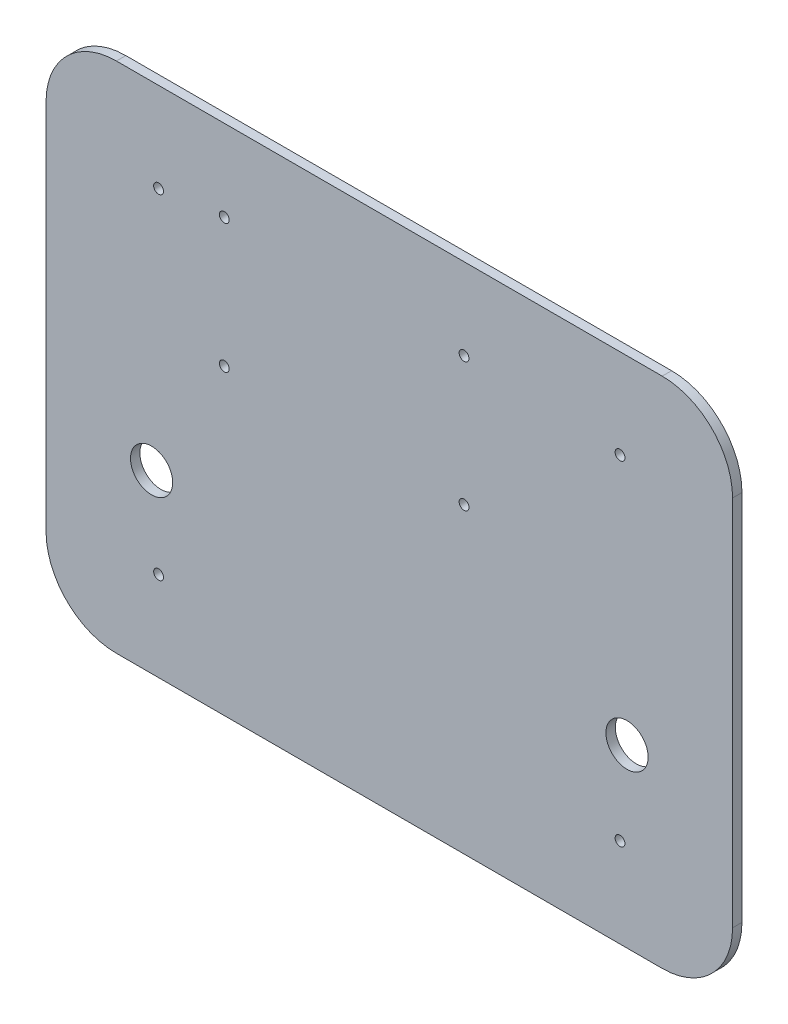
ISO-10303-21;
HEADER;
FILE_DESCRIPTION(('STEP AP214'),'2;1');
FILE_NAME('part.step','',(''),(''),'','','');
FILE_SCHEMA(('AUTOMOTIVE_DESIGN { 1 0 10303 214 1 1 1 1 }'));
ENDSEC;
DATA;
#1=APPLICATION_CONTEXT('core data for automotive mechanical design processes');
#2=APPLICATION_PROTOCOL_DEFINITION('international standard','automotive_design',2000,#1);
#3=PRODUCT_CONTEXT('',#1,'mechanical');
#4=PRODUCT('Part','Part','',(#3));
#5=PRODUCT_RELATED_PRODUCT_CATEGORY('part','',(#4));
#6=PRODUCT_DEFINITION_FORMATION('','',#4);
#7=PRODUCT_DEFINITION_CONTEXT('part definition',#1,'design');
#8=PRODUCT_DEFINITION('design','',#6,#7);
#9=PRODUCT_DEFINITION_SHAPE('','',#8);
#10=(LENGTH_UNIT() NAMED_UNIT(*) SI_UNIT(.MILLI.,.METRE.));
#11=(NAMED_UNIT(*) PLANE_ANGLE_UNIT() SI_UNIT($,.RADIAN.));
#12=(NAMED_UNIT(*) SI_UNIT($,.STERADIAN.) SOLID_ANGLE_UNIT());
#13=UNCERTAINTY_MEASURE_WITH_UNIT(LENGTH_MEASURE(1.E-05),#10,'distance_accuracy_value','');
#14=(GEOMETRIC_REPRESENTATION_CONTEXT(3) GLOBAL_UNCERTAINTY_ASSIGNED_CONTEXT((#13)) GLOBAL_UNIT_ASSIGNED_CONTEXT((#10,
#11,#12)) REPRESENTATION_CONTEXT('',''));
#15=CARTESIAN_POINT('',(0.,0.,0.));
#16=DIRECTION('',(0.,0.,1.));
#17=DIRECTION('',(1.,0.,0.));
#18=AXIS2_PLACEMENT_3D('',#15,#16,#17);
#19=CARTESIAN_POINT('',(-116.3599938182,-79.35999381827,4.));
#20=DIRECTION('',(0.,0.,-1.));
#21=DIRECTION('',(-1.,0.,0.));
#22=AXIS2_PLACEMENT_3D('',#19,#20,#21);
#23=PLANE('',#22);
#24=CARTESIAN_POINT('',(-70.3599938181999,19.6599938182702,4.));
#25=DIRECTION('',(0.,0.,1.));
#26=DIRECTION('',(1.,0.,0.));
#27=AXIS2_PLACEMENT_3D('',#24,#25,#26);
#28=CIRCLE('',#27,2.1);
#29=CARTESIAN_POINT('',(-68.2599938181998,19.6599938182702,4.));
#30=VERTEX_POINT('',#29);
#31=EDGE_CURVE('E227',#30,#30,#28,.T.);
#32=ORIENTED_EDGE('',*,*,#31,.F.);
#33=EDGE_LOOP('',(#32));
#34=FACE_BOUND('',#33,.T.);
#35=CARTESIAN_POINT('',(31.8599938181998,74.6599938182699,4.));
#36=DIRECTION('',(0.,0.,1.));
#37=DIRECTION('',(1.,0.,0.));
#38=AXIS2_PLACEMENT_3D('',#35,#36,#37);
#39=CIRCLE('',#38,2.1);
#40=CARTESIAN_POINT('',(33.9599938181998,74.6599938182699,4.));
#41=VERTEX_POINT('',#40);
#42=EDGE_CURVE('E233',#41,#41,#39,.T.);
#43=ORIENTED_EDGE('',*,*,#42,.F.);
#44=EDGE_LOOP('',(#43));
#45=FACE_BOUND('',#44,.T.);
#46=CARTESIAN_POINT('',(31.8599938181998,19.65999381827,4.));
#47=DIRECTION('',(0.,0.,1.));
#48=DIRECTION('',(1.,0.,0.));
#49=AXIS2_PLACEMENT_3D('',#46,#47,#48);
#50=CIRCLE('',#49,2.1);
#51=CARTESIAN_POINT('',(33.9599938181998,19.65999381827,4.));
#52=VERTEX_POINT('',#51);
#53=EDGE_CURVE('E234',#52,#52,#50,.T.);
#54=ORIENTED_EDGE('',*,*,#53,.F.);
#55=EDGE_LOOP('',(#54));
#56=FACE_BOUND('',#55,.T.);
#57=CARTESIAN_POINT('',(-70.3599938181998,74.6599938182702,4.));
#58=DIRECTION('',(0.,0.,1.));
#59=DIRECTION('',(1.,0.,0.));
#60=AXIS2_PLACEMENT_3D('',#57,#58,#59);
#61=CIRCLE('',#60,2.1);
#62=CARTESIAN_POINT('',(-68.2599938181998,74.6599938182702,4.));
#63=VERTEX_POINT('',#62);
#64=EDGE_CURVE('E224',#63,#63,#61,.T.);
#65=ORIENTED_EDGE('',*,*,#64,.F.);
#66=EDGE_LOOP('',(#65));
#67=FACE_BOUND('',#66,.T.);
#68=CARTESIAN_POINT('',(-116.3599938182,-79.35999381827,4.));
#69=DIRECTION('',(0.,0.,1.));
#70=DIRECTION('',(-1.,0.,0.));
#71=AXIS2_PLACEMENT_3D('',#68,#69,#70);
#72=CIRCLE('',#71,30.);
#73=CARTESIAN_POINT('',(-146.3599938182,-79.3599938182698,4.));
#74=VERTEX_POINT('',#73);
#75=CARTESIAN_POINT('',(-116.3599938182,-109.35999381827,4.));
#76=VERTEX_POINT('',#75);
#77=EDGE_CURVE('E154',#74,#76,#72,.T.);
#78=ORIENTED_EDGE('',*,*,#77,.T.);
#79=DIRECTION('',(1.,0.,0.));
#80=VECTOR('',#79,1.);
#81=CARTESIAN_POINT('',(-116.3599938182,-109.35999381827,4.));
#82=LINE('',#81,#80);
#83=CARTESIAN_POINT('',(116.3599938182,-109.35999381827,4.));
#84=VERTEX_POINT('',#83);
#85=EDGE_CURVE('E102',#76,#84,#82,.T.);
#86=ORIENTED_EDGE('',*,*,#85,.T.);
#87=CARTESIAN_POINT('',(116.3599938182,-79.35999381827,4.));
#88=DIRECTION('',(0.,0.,1.));
#89=DIRECTION('',(1.,0.,0.));
#90=AXIS2_PLACEMENT_3D('',#87,#88,#89);
#91=CIRCLE('',#90,30.);
#92=CARTESIAN_POINT('',(146.3599938182,-79.35999381827,4.));
#93=VERTEX_POINT('',#92);
#94=EDGE_CURVE('E169',#84,#93,#91,.T.);
#95=ORIENTED_EDGE('',*,*,#94,.T.);
#96=DIRECTION('',(0.,1.,0.));
#97=VECTOR('',#96,1.);
#98=CARTESIAN_POINT('',(146.3599938182,-79.3599938182698,4.));
#99=LINE('',#98,#97);
#100=CARTESIAN_POINT('',(146.3599938182,79.3599938182698,4.));
#101=VERTEX_POINT('',#100);
#102=EDGE_CURVE('E182',#93,#101,#99,.T.);
#103=ORIENTED_EDGE('',*,*,#102,.T.);
#104=CARTESIAN_POINT('',(116.3599938182,79.35999381827,4.));
#105=DIRECTION('',(0.,0.,1.));
#106=DIRECTION('',(-1.,0.,0.));
#107=AXIS2_PLACEMENT_3D('',#104,#105,#106);
#108=CIRCLE('',#107,30.);
#109=CARTESIAN_POINT('',(116.3599938182,109.35999381827,4.));
#110=VERTEX_POINT('',#109);
#111=EDGE_CURVE('E121',#101,#110,#108,.T.);
#112=ORIENTED_EDGE('',*,*,#111,.T.);
#113=DIRECTION('',(-1.,0.,0.));
#114=VECTOR('',#113,1.);
#115=CARTESIAN_POINT('',(-116.3599938182,109.35999381827,4.));
#116=LINE('',#115,#114);
#117=CARTESIAN_POINT('',(-116.3599938182,109.35999381827,4.));
#118=VERTEX_POINT('',#117);
#119=EDGE_CURVE('E115',#110,#118,#116,.T.);
#120=ORIENTED_EDGE('',*,*,#119,.T.);
#121=CARTESIAN_POINT('',(-116.3599938182,79.35999381827,4.));
#122=DIRECTION('',(0.,0.,1.));
#123=DIRECTION('',(-1.,0.,0.));
#124=AXIS2_PLACEMENT_3D('',#121,#122,#123);
#125=CIRCLE('',#124,30.);
#126=CARTESIAN_POINT('',(-146.3599938182,79.3599938182698,4.));
#127=VERTEX_POINT('',#126);
#128=EDGE_CURVE('E119',#118,#127,#125,.T.);
#129=ORIENTED_EDGE('',*,*,#128,.T.);
#130=DIRECTION('',(0.,-1.,0.));
#131=VECTOR('',#130,1.);
#132=CARTESIAN_POINT('',(-146.3599938182,-79.3599938182698,4.));
#133=LINE('',#132,#131);
#134=EDGE_CURVE('E59',#127,#74,#133,.T.);
#135=ORIENTED_EDGE('',*,*,#134,.T.);
#136=EDGE_LOOP('',(#78,#86,#95,#103,#112,#120,#129,#135));
#137=FACE_BOUND('',#136,.T.);
#138=CARTESIAN_POINT('',(-101.3599938182,-34.35999381827,4.));
#139=DIRECTION('',(0.,0.,1.));
#140=DIRECTION('',(1.,0.,0.));
#141=AXIS2_PLACEMENT_3D('',#138,#139,#140);
#142=CIRCLE('',#141,9.);
#143=CARTESIAN_POINT('',(-92.3599938182,-34.35999381827,4.));
#144=VERTEX_POINT('',#143);
#145=EDGE_CURVE('E143',#144,#144,#142,.T.);
#146=ORIENTED_EDGE('',*,*,#145,.F.);
#147=EDGE_LOOP('',(#146));
#148=FACE_BOUND('',#147,.T.);
#149=CARTESIAN_POINT('',(101.3599938182,-34.35999381827,4.));
#150=DIRECTION('',(0.,0.,1.));
#151=DIRECTION('',(1.,0.,0.));
#152=AXIS2_PLACEMENT_3D('',#149,#150,#151);
#153=CIRCLE('',#152,9.);
#154=CARTESIAN_POINT('',(110.3599938182,-34.35999381827,4.));
#155=VERTEX_POINT('',#154);
#156=EDGE_CURVE('E191',#155,#155,#153,.T.);
#157=ORIENTED_EDGE('',*,*,#156,.F.);
#158=EDGE_LOOP('',(#157));
#159=FACE_BOUND('',#158,.T.);
#160=CARTESIAN_POINT('',(-98.375,71.25,4.));
#161=DIRECTION('',(0.,0.,1.));
#162=DIRECTION('',(1.,0.,0.));
#163=AXIS2_PLACEMENT_3D('',#160,#161,#162);
#164=CIRCLE('',#163,2.1);
#165=CARTESIAN_POINT('',(-96.275,71.25,4.));
#166=VERTEX_POINT('',#165);
#167=EDGE_CURVE('E197',#166,#166,#164,.T.);
#168=ORIENTED_EDGE('',*,*,#167,.F.);
#169=EDGE_LOOP('',(#168));
#170=FACE_BOUND('',#169,.T.);
#171=CARTESIAN_POINT('',(98.375,71.25,4.));
#172=DIRECTION('',(0.,0.,1.));
#173=DIRECTION('',(1.,0.,0.));
#174=AXIS2_PLACEMENT_3D('',#171,#172,#173);
#175=CIRCLE('',#174,2.1);
#176=CARTESIAN_POINT('',(100.475,71.25,4.));
#177=VERTEX_POINT('',#176);
#178=EDGE_CURVE('E203',#177,#177,#175,.T.);
#179=ORIENTED_EDGE('',*,*,#178,.F.);
#180=EDGE_LOOP('',(#179));
#181=FACE_BOUND('',#180,.T.);
#182=CARTESIAN_POINT('',(98.375,-71.25,4.));
#183=DIRECTION('',(0.,0.,1.));
#184=DIRECTION('',(1.,0.,0.));
#185=AXIS2_PLACEMENT_3D('',#182,#183,#184);
#186=CIRCLE('',#185,2.1);
#187=CARTESIAN_POINT('',(100.475,-71.25,4.));
#188=VERTEX_POINT('',#187);
#189=EDGE_CURVE('E209',#188,#188,#186,.T.);
#190=ORIENTED_EDGE('',*,*,#189,.F.);
#191=EDGE_LOOP('',(#190));
#192=FACE_BOUND('',#191,.T.);
#193=CARTESIAN_POINT('',(-98.375,-71.25,4.));
#194=DIRECTION('',(0.,0.,1.));
#195=DIRECTION('',(1.,0.,0.));
#196=AXIS2_PLACEMENT_3D('',#193,#194,#195);
#197=CIRCLE('',#196,2.1);
#198=CARTESIAN_POINT('',(-96.275,-71.25,4.));
#199=VERTEX_POINT('',#198);
#200=EDGE_CURVE('E215',#199,#199,#197,.T.);
#201=ORIENTED_EDGE('',*,*,#200,.F.);
#202=EDGE_LOOP('',(#201));
#203=FACE_BOUND('',#202,.T.);
#204=ADVANCED_FACE('F42',(#34,#45,#56,#67,#137,#148,#159,#170,#181,#192,#203),#23,.F.);
#205=CARTESIAN_POINT('',(-116.3599938182,-79.35999381827,0.));
#206=DIRECTION('',(0.,0.,-1.));
#207=DIRECTION('',(-1.,0.,0.));
#208=AXIS2_PLACEMENT_3D('',#205,#206,#207);
#209=PLANE('',#208);
#210=CARTESIAN_POINT('',(-70.3599938181999,19.6599938182702,0.));
#211=DIRECTION('',(0.,0.,1.));
#212=DIRECTION('',(1.,0.,0.));
#213=AXIS2_PLACEMENT_3D('',#210,#211,#212);
#214=CIRCLE('',#213,2.1);
#215=CARTESIAN_POINT('',(-68.2599938181998,19.6599938182702,0.));
#216=VERTEX_POINT('',#215);
#217=EDGE_CURVE('E237',#216,#216,#214,.T.);
#218=ORIENTED_EDGE('',*,*,#217,.T.);
#219=EDGE_LOOP('',(#218));
#220=FACE_BOUND('',#219,.T.);
#221=CARTESIAN_POINT('',(31.8599938181998,74.6599938182699,0.));
#222=DIRECTION('',(0.,0.,1.));
#223=DIRECTION('',(1.,0.,0.));
#224=AXIS2_PLACEMENT_3D('',#221,#222,#223);
#225=CIRCLE('',#224,2.1);
#226=CARTESIAN_POINT('',(33.9599938181998,74.6599938182699,0.));
#227=VERTEX_POINT('',#226);
#228=EDGE_CURVE('E230',#227,#227,#225,.T.);
#229=ORIENTED_EDGE('',*,*,#228,.T.);
#230=EDGE_LOOP('',(#229));
#231=FACE_BOUND('',#230,.T.);
#232=CARTESIAN_POINT('',(31.8599938181998,19.65999381827,0.));
#233=DIRECTION('',(0.,0.,1.));
#234=DIRECTION('',(1.,0.,0.));
#235=AXIS2_PLACEMENT_3D('',#232,#233,#234);
#236=CIRCLE('',#235,2.1);
#237=CARTESIAN_POINT('',(33.9599938181998,19.65999381827,0.));
#238=VERTEX_POINT('',#237);
#239=EDGE_CURVE('E244',#238,#238,#236,.T.);
#240=ORIENTED_EDGE('',*,*,#239,.T.);
#241=EDGE_LOOP('',(#240));
#242=FACE_BOUND('',#241,.T.);
#243=CARTESIAN_POINT('',(-70.3599938181998,74.6599938182702,0.));
#244=DIRECTION('',(0.,0.,1.));
#245=DIRECTION('',(1.,0.,0.));
#246=AXIS2_PLACEMENT_3D('',#243,#244,#245);
#247=CIRCLE('',#246,2.1);
#248=CARTESIAN_POINT('',(-68.2599938181998,74.6599938182702,0.));
#249=VERTEX_POINT('',#248);
#250=EDGE_CURVE('E221',#249,#249,#247,.T.);
#251=ORIENTED_EDGE('',*,*,#250,.T.);
#252=EDGE_LOOP('',(#251));
#253=FACE_BOUND('',#252,.T.);
#254=CARTESIAN_POINT('',(98.375,-71.25,0.));
#255=DIRECTION('',(0.,0.,1.));
#256=DIRECTION('',(1.,0.,0.));
#257=AXIS2_PLACEMENT_3D('',#254,#255,#256);
#258=CIRCLE('',#257,2.1);
#259=CARTESIAN_POINT('',(100.475,-71.25,0.));
#260=VERTEX_POINT('',#259);
#261=EDGE_CURVE('E212',#260,#260,#258,.T.);
#262=ORIENTED_EDGE('',*,*,#261,.T.);
#263=EDGE_LOOP('',(#262));
#264=FACE_BOUND('',#263,.T.);
#265=CARTESIAN_POINT('',(-98.375,71.25,0.));
#266=DIRECTION('',(0.,0.,1.));
#267=DIRECTION('',(1.,0.,0.));
#268=AXIS2_PLACEMENT_3D('',#265,#266,#267);
#269=CIRCLE('',#268,2.1);
#270=CARTESIAN_POINT('',(-96.275,71.25,0.));
#271=VERTEX_POINT('',#270);
#272=EDGE_CURVE('E200',#271,#271,#269,.T.);
#273=ORIENTED_EDGE('',*,*,#272,.T.);
#274=EDGE_LOOP('',(#273));
#275=FACE_BOUND('',#274,.T.);
#276=CARTESIAN_POINT('',(-101.3599938182,-34.35999381827,0.));
#277=DIRECTION('',(0.,0.,1.));
#278=DIRECTION('',(1.,0.,0.));
#279=AXIS2_PLACEMENT_3D('',#276,#277,#278);
#280=CIRCLE('',#279,9.);
#281=CARTESIAN_POINT('',(-92.3599938182,-34.35999381827,0.));
#282=VERTEX_POINT('',#281);
#283=EDGE_CURVE('E188',#282,#282,#280,.T.);
#284=ORIENTED_EDGE('',*,*,#283,.T.);
#285=EDGE_LOOP('',(#284));
#286=FACE_BOUND('',#285,.T.);
#287=CARTESIAN_POINT('',(-116.3599938182,-79.35999381827,0.));
#288=DIRECTION('',(0.,0.,1.));
#289=DIRECTION('',(-1.,0.,0.));
#290=AXIS2_PLACEMENT_3D('',#287,#288,#289);
#291=CIRCLE('',#290,30.);
#292=CARTESIAN_POINT('',(-146.3599938182,-79.3599938182698,0.));
#293=VERTEX_POINT('',#292);
#294=CARTESIAN_POINT('',(-116.3599938182,-109.35999381827,0.));
#295=VERTEX_POINT('',#294);
#296=EDGE_CURVE('E139',#293,#295,#291,.T.);
#297=ORIENTED_EDGE('',*,*,#296,.F.);
#298=DIRECTION('',(0.,-1.,0.));
#299=VECTOR('',#298,1.);
#300=CARTESIAN_POINT('',(-146.3599938182,-79.3599938182698,0.));
#301=LINE('',#300,#299);
#302=CARTESIAN_POINT('',(-146.3599938182,79.3599938182698,0.));
#303=VERTEX_POINT('',#302);
#304=EDGE_CURVE('E94',#303,#293,#301,.T.);
#305=ORIENTED_EDGE('',*,*,#304,.F.);
#306=CARTESIAN_POINT('',(-116.3599938182,79.35999381827,0.));
#307=DIRECTION('',(0.,0.,1.));
#308=DIRECTION('',(-1.,0.,0.));
#309=AXIS2_PLACEMENT_3D('',#306,#307,#308);
#310=CIRCLE('',#309,30.);
#311=CARTESIAN_POINT('',(-116.3599938182,109.35999381827,0.));
#312=VERTEX_POINT('',#311);
#313=EDGE_CURVE('E88',#312,#303,#310,.T.);
#314=ORIENTED_EDGE('',*,*,#313,.F.);
#315=DIRECTION('',(-1.,0.,0.));
#316=VECTOR('',#315,1.);
#317=CARTESIAN_POINT('',(-116.3599938182,109.35999381827,0.));
#318=LINE('',#317,#316);
#319=CARTESIAN_POINT('',(116.3599938182,109.35999381827,0.));
#320=VERTEX_POINT('',#319);
#321=EDGE_CURVE('E129',#320,#312,#318,.T.);
#322=ORIENTED_EDGE('',*,*,#321,.F.);
#323=CARTESIAN_POINT('',(116.3599938182,79.35999381827,0.));
#324=DIRECTION('',(0.,0.,1.));
#325=DIRECTION('',(-1.,0.,0.));
#326=AXIS2_PLACEMENT_3D('',#323,#324,#325);
#327=CIRCLE('',#326,30.);
#328=CARTESIAN_POINT('',(146.3599938182,79.3599938182698,0.));
#329=VERTEX_POINT('',#328);
#330=EDGE_CURVE('E149',#329,#320,#327,.T.);
#331=ORIENTED_EDGE('',*,*,#330,.F.);
#332=DIRECTION('',(0.,1.,0.));
#333=VECTOR('',#332,1.);
#334=CARTESIAN_POINT('',(146.3599938182,-79.3599938182698,0.));
#335=LINE('',#334,#333);
#336=CARTESIAN_POINT('',(146.3599938182,-79.35999381827,0.));
#337=VERTEX_POINT('',#336);
#338=EDGE_CURVE('E147',#337,#329,#335,.T.);
#339=ORIENTED_EDGE('',*,*,#338,.F.);
#340=CARTESIAN_POINT('',(116.3599938182,-79.35999381827,0.));
#341=DIRECTION('',(0.,0.,1.));
#342=DIRECTION('',(1.,0.,0.));
#343=AXIS2_PLACEMENT_3D('',#340,#341,#342);
#344=CIRCLE('',#343,30.);
#345=CARTESIAN_POINT('',(116.3599938182,-109.35999381827,0.));
#346=VERTEX_POINT('',#345);
#347=EDGE_CURVE('E145',#346,#337,#344,.T.);
#348=ORIENTED_EDGE('',*,*,#347,.F.);
#349=DIRECTION('',(1.,0.,0.));
#350=VECTOR('',#349,1.);
#351=CARTESIAN_POINT('',(-116.3599938182,-109.35999381827,0.));
#352=LINE('',#351,#350);
#353=EDGE_CURVE('E142',#295,#346,#352,.T.);
#354=ORIENTED_EDGE('',*,*,#353,.F.);
#355=EDGE_LOOP('',(#297,#305,#314,#322,#331,#339,#348,#354));
#356=FACE_BOUND('',#355,.T.);
#357=CARTESIAN_POINT('',(101.3599938182,-34.35999381827,0.));
#358=DIRECTION('',(0.,0.,1.));
#359=DIRECTION('',(1.,0.,0.));
#360=AXIS2_PLACEMENT_3D('',#357,#358,#359);
#361=CIRCLE('',#360,9.);
#362=CARTESIAN_POINT('',(110.3599938182,-34.35999381827,0.));
#363=VERTEX_POINT('',#362);
#364=EDGE_CURVE('E194',#363,#363,#361,.T.);
#365=ORIENTED_EDGE('',*,*,#364,.T.);
#366=EDGE_LOOP('',(#365));
#367=FACE_BOUND('',#366,.T.);
#368=CARTESIAN_POINT('',(98.375,71.25,0.));
#369=DIRECTION('',(0.,0.,1.));
#370=DIRECTION('',(1.,0.,0.));
#371=AXIS2_PLACEMENT_3D('',#368,#369,#370);
#372=CIRCLE('',#371,2.1);
#373=CARTESIAN_POINT('',(100.475,71.25,0.));
#374=VERTEX_POINT('',#373);
#375=EDGE_CURVE('E206',#374,#374,#372,.T.);
#376=ORIENTED_EDGE('',*,*,#375,.T.);
#377=EDGE_LOOP('',(#376));
#378=FACE_BOUND('',#377,.T.);
#379=CARTESIAN_POINT('',(-98.375,-71.25,0.));
#380=DIRECTION('',(0.,0.,1.));
#381=DIRECTION('',(1.,0.,0.));
#382=AXIS2_PLACEMENT_3D('',#379,#380,#381);
#383=CIRCLE('',#382,2.1);
#384=CARTESIAN_POINT('',(-96.275,-71.25,0.));
#385=VERTEX_POINT('',#384);
#386=EDGE_CURVE('E218',#385,#385,#383,.T.);
#387=ORIENTED_EDGE('',*,*,#386,.T.);
#388=EDGE_LOOP('',(#387));
#389=FACE_BOUND('',#388,.T.);
#390=ADVANCED_FACE('F173',(#220,#231,#242,#253,#264,#275,#286,#356,#367,#378,#389),#209,.T.);
#391=CARTESIAN_POINT('',(-116.3599938182,-79.35999381827,4.));
#392=DIRECTION('',(0.,0.,-1.));
#393=DIRECTION('',(-1.,0.,0.));
#394=AXIS2_PLACEMENT_3D('',#391,#392,#393);
#395=CYLINDRICAL_SURFACE('',#394,30.);
#396=ORIENTED_EDGE('',*,*,#296,.T.);
#397=DIRECTION('',(0.,0.,-1.));
#398=VECTOR('',#397,1.);
#399=CARTESIAN_POINT('',(-116.3599938182,-109.35999381827,4.));
#400=LINE('',#399,#398);
#401=EDGE_CURVE('E11',#76,#295,#400,.T.);
#402=ORIENTED_EDGE('',*,*,#401,.F.);
#403=ORIENTED_EDGE('',*,*,#77,.F.);
#404=DIRECTION('',(0.,0.,-1.));
#405=VECTOR('',#404,1.);
#406=CARTESIAN_POINT('',(-146.3599938182,-79.3599938182698,4.));
#407=LINE('',#406,#405);
#408=EDGE_CURVE('E135',#74,#293,#407,.T.);
#409=ORIENTED_EDGE('',*,*,#408,.T.);
#410=EDGE_LOOP('',(#396,#402,#403,#409));
#411=FACE_BOUND('',#410,.T.);
#412=ADVANCED_FACE('F44',(#411),#395,.T.);
#413=CARTESIAN_POINT('',(-116.3599938182,-109.35999381827,4.));
#414=DIRECTION('',(0.,1.,0.));
#415=DIRECTION('',(0.,0.,1.));
#416=AXIS2_PLACEMENT_3D('',#413,#414,#415);
#417=PLANE('',#416);
#418=ORIENTED_EDGE('',*,*,#353,.T.);
#419=DIRECTION('',(0.,0.,-1.));
#420=VECTOR('',#419,1.);
#421=CARTESIAN_POINT('',(116.3599938182,-109.35999381827,4.));
#422=LINE('',#421,#420);
#423=EDGE_CURVE('E51',#84,#346,#422,.T.);
#424=ORIENTED_EDGE('',*,*,#423,.F.);
#425=ORIENTED_EDGE('',*,*,#85,.F.);
#426=ORIENTED_EDGE('',*,*,#401,.T.);
#427=EDGE_LOOP('',(#418,#424,#425,#426));
#428=FACE_BOUND('',#427,.T.);
#429=ADVANCED_FACE('F312',(#428),#417,.F.);
#430=CARTESIAN_POINT('',(116.3599938182,-79.35999381827,4.));
#431=DIRECTION('',(0.,0.,-1.));
#432=DIRECTION('',(-1.,0.,0.));
#433=AXIS2_PLACEMENT_3D('',#430,#431,#432);
#434=CYLINDRICAL_SURFACE('',#433,30.);
#435=ORIENTED_EDGE('',*,*,#347,.T.);
#436=DIRECTION('',(0.,0.,-1.));
#437=VECTOR('',#436,1.);
#438=CARTESIAN_POINT('',(146.3599938182,-79.35999381827,4.));
#439=LINE('',#438,#437);
#440=EDGE_CURVE('E161',#93,#337,#439,.T.);
#441=ORIENTED_EDGE('',*,*,#440,.F.);
#442=ORIENTED_EDGE('',*,*,#94,.F.);
#443=ORIENTED_EDGE('',*,*,#423,.T.);
#444=EDGE_LOOP('',(#435,#441,#442,#443));
#445=FACE_BOUND('',#444,.T.);
#446=ADVANCED_FACE('F167',(#445),#434,.T.);
#447=CARTESIAN_POINT('',(146.3599938182,-79.3599938182698,4.));
#448=DIRECTION('',(-1.,0.,0.));
#449=DIRECTION('',(0.,0.,1.));
#450=AXIS2_PLACEMENT_3D('',#447,#448,#449);
#451=PLANE('',#450);
#452=ORIENTED_EDGE('',*,*,#338,.T.);
#453=DIRECTION('',(0.,0.,-1.));
#454=VECTOR('',#453,1.);
#455=CARTESIAN_POINT('',(146.3599938182,79.3599938182698,4.));
#456=LINE('',#455,#454);
#457=EDGE_CURVE('E158',#101,#329,#456,.T.);
#458=ORIENTED_EDGE('',*,*,#457,.F.);
#459=ORIENTED_EDGE('',*,*,#102,.F.);
#460=ORIENTED_EDGE('',*,*,#440,.T.);
#461=EDGE_LOOP('',(#452,#458,#459,#460));
#462=FACE_BOUND('',#461,.T.);
#463=ADVANCED_FACE('F178',(#462),#451,.F.);
#464=CARTESIAN_POINT('',(116.3599938182,79.35999381827,4.));
#465=DIRECTION('',(0.,0.,-1.));
#466=DIRECTION('',(-1.,0.,0.));
#467=AXIS2_PLACEMENT_3D('',#464,#465,#466);
#468=CYLINDRICAL_SURFACE('',#467,30.);
#469=ORIENTED_EDGE('',*,*,#330,.T.);
#470=DIRECTION('',(0.,0.,-1.));
#471=VECTOR('',#470,1.);
#472=CARTESIAN_POINT('',(116.3599938182,109.35999381827,4.));
#473=LINE('',#472,#471);
#474=EDGE_CURVE('E130',#110,#320,#473,.T.);
#475=ORIENTED_EDGE('',*,*,#474,.F.);
#476=ORIENTED_EDGE('',*,*,#111,.F.);
#477=ORIENTED_EDGE('',*,*,#457,.T.);
#478=EDGE_LOOP('',(#469,#475,#476,#477));
#479=FACE_BOUND('',#478,.T.);
#480=ADVANCED_FACE('F181',(#479),#468,.T.);
#481=CARTESIAN_POINT('',(-116.3599938182,109.35999381827,4.));
#482=DIRECTION('',(0.,-1.,0.));
#483=DIRECTION('',(0.,0.,-1.));
#484=AXIS2_PLACEMENT_3D('',#481,#482,#483);
#485=PLANE('',#484);
#486=ORIENTED_EDGE('',*,*,#321,.T.);
#487=DIRECTION('',(0.,0.,-1.));
#488=VECTOR('',#487,1.);
#489=CARTESIAN_POINT('',(-116.3599938182,109.35999381827,4.));
#490=LINE('',#489,#488);
#491=EDGE_CURVE('E126',#118,#312,#490,.T.);
#492=ORIENTED_EDGE('',*,*,#491,.F.);
#493=ORIENTED_EDGE('',*,*,#119,.F.);
#494=ORIENTED_EDGE('',*,*,#474,.T.);
#495=EDGE_LOOP('',(#486,#492,#493,#494));
#496=FACE_BOUND('',#495,.T.);
#497=ADVANCED_FACE('F127',(#496),#485,.F.);
#498=CARTESIAN_POINT('',(-116.3599938182,79.35999381827,4.));
#499=DIRECTION('',(0.,0.,-1.));
#500=DIRECTION('',(-1.,0.,0.));
#501=AXIS2_PLACEMENT_3D('',#498,#499,#500);
#502=CYLINDRICAL_SURFACE('',#501,30.);
#503=ORIENTED_EDGE('',*,*,#313,.T.);
#504=DIRECTION('',(0.,0.,-1.));
#505=VECTOR('',#504,1.);
#506=CARTESIAN_POINT('',(-146.3599938182,79.3599938182698,4.));
#507=LINE('',#506,#505);
#508=EDGE_CURVE('E131',#127,#303,#507,.T.);
#509=ORIENTED_EDGE('',*,*,#508,.F.);
#510=ORIENTED_EDGE('',*,*,#128,.F.);
#511=ORIENTED_EDGE('',*,*,#491,.T.);
#512=EDGE_LOOP('',(#503,#509,#510,#511));
#513=FACE_BOUND('',#512,.T.);
#514=ADVANCED_FACE('F133',(#513),#502,.T.);
#515=CARTESIAN_POINT('',(-146.3599938182,-79.3599938182698,4.));
#516=DIRECTION('',(1.,0.,0.));
#517=DIRECTION('',(0.,0.,-1.));
#518=AXIS2_PLACEMENT_3D('',#515,#516,#517);
#519=PLANE('',#518);
#520=ORIENTED_EDGE('',*,*,#304,.T.);
#521=ORIENTED_EDGE('',*,*,#408,.F.);
#522=ORIENTED_EDGE('',*,*,#134,.F.);
#523=ORIENTED_EDGE('',*,*,#508,.T.);
#524=EDGE_LOOP('',(#520,#521,#522,#523));
#525=FACE_BOUND('',#524,.T.);
#526=ADVANCED_FACE('F295',(#525),#519,.F.);
#527=CARTESIAN_POINT('',(-101.3599938182,-34.35999381827,4.));
#528=DIRECTION('',(0.,0.,-1.));
#529=DIRECTION('',(-1.,0.,0.));
#530=AXIS2_PLACEMENT_3D('',#527,#528,#529);
#531=CYLINDRICAL_SURFACE('',#530,9.);
#532=ORIENTED_EDGE('',*,*,#145,.T.);
#533=EDGE_LOOP('',(#532));
#534=FACE_BOUND('',#533,.T.);
#535=ORIENTED_EDGE('',*,*,#283,.F.);
#536=EDGE_LOOP('',(#535));
#537=FACE_BOUND('',#536,.T.);
#538=ADVANCED_FACE('F292',(#534,#537),#531,.F.);
#539=CARTESIAN_POINT('',(101.3599938182,-34.35999381827,4.));
#540=DIRECTION('',(0.,0.,-1.));
#541=DIRECTION('',(-1.,0.,0.));
#542=AXIS2_PLACEMENT_3D('',#539,#540,#541);
#543=CYLINDRICAL_SURFACE('',#542,9.);
#544=ORIENTED_EDGE('',*,*,#156,.T.);
#545=EDGE_LOOP('',(#544));
#546=FACE_BOUND('',#545,.T.);
#547=ORIENTED_EDGE('',*,*,#364,.F.);
#548=EDGE_LOOP('',(#547));
#549=FACE_BOUND('',#548,.T.);
#550=ADVANCED_FACE('F288',(#546,#549),#543,.F.);
#551=CARTESIAN_POINT('',(-98.375,71.25,4.));
#552=DIRECTION('',(0.,0.,-1.));
#553=DIRECTION('',(-1.,0.,0.));
#554=AXIS2_PLACEMENT_3D('',#551,#552,#553);
#555=CYLINDRICAL_SURFACE('',#554,2.1);
#556=ORIENTED_EDGE('',*,*,#167,.T.);
#557=EDGE_LOOP('',(#556));
#558=FACE_BOUND('',#557,.T.);
#559=ORIENTED_EDGE('',*,*,#272,.F.);
#560=EDGE_LOOP('',(#559));
#561=FACE_BOUND('',#560,.T.);
#562=ADVANCED_FACE('F284',(#558,#561),#555,.F.);
#563=CARTESIAN_POINT('',(98.375,71.25,4.));
#564=DIRECTION('',(0.,0.,-1.));
#565=DIRECTION('',(-1.,0.,0.));
#566=AXIS2_PLACEMENT_3D('',#563,#564,#565);
#567=CYLINDRICAL_SURFACE('',#566,2.1);
#568=ORIENTED_EDGE('',*,*,#178,.T.);
#569=EDGE_LOOP('',(#568));
#570=FACE_BOUND('',#569,.T.);
#571=ORIENTED_EDGE('',*,*,#375,.F.);
#572=EDGE_LOOP('',(#571));
#573=FACE_BOUND('',#572,.T.);
#574=ADVANCED_FACE('F280',(#570,#573),#567,.F.);
#575=CARTESIAN_POINT('',(98.375,-71.25,4.));
#576=DIRECTION('',(0.,0.,-1.));
#577=DIRECTION('',(-1.,0.,0.));
#578=AXIS2_PLACEMENT_3D('',#575,#576,#577);
#579=CYLINDRICAL_SURFACE('',#578,2.1);
#580=ORIENTED_EDGE('',*,*,#189,.T.);
#581=EDGE_LOOP('',(#580));
#582=FACE_BOUND('',#581,.T.);
#583=ORIENTED_EDGE('',*,*,#261,.F.);
#584=EDGE_LOOP('',(#583));
#585=FACE_BOUND('',#584,.T.);
#586=ADVANCED_FACE('F271',(#582,#585),#579,.F.);
#587=CARTESIAN_POINT('',(-98.375,-71.25,4.));
#588=DIRECTION('',(0.,0.,-1.));
#589=DIRECTION('',(-1.,0.,0.));
#590=AXIS2_PLACEMENT_3D('',#587,#588,#589);
#591=CYLINDRICAL_SURFACE('',#590,2.1);
#592=ORIENTED_EDGE('',*,*,#200,.T.);
#593=EDGE_LOOP('',(#592));
#594=FACE_BOUND('',#593,.T.);
#595=ORIENTED_EDGE('',*,*,#386,.F.);
#596=EDGE_LOOP('',(#595));
#597=FACE_BOUND('',#596,.T.);
#598=ADVANCED_FACE('F260',(#594,#597),#591,.F.);
#599=CARTESIAN_POINT('',(-70.3599938181998,74.6599938182702,0.));
#600=DIRECTION('',(0.,0.,1.));
#601=DIRECTION('',(1.,0.,0.));
#602=AXIS2_PLACEMENT_3D('',#599,#600,#601);
#603=CYLINDRICAL_SURFACE('',#602,2.1);
#604=ORIENTED_EDGE('',*,*,#250,.F.);
#605=EDGE_LOOP('',(#604));
#606=FACE_BOUND('',#605,.T.);
#607=ORIENTED_EDGE('',*,*,#64,.T.);
#608=EDGE_LOOP('',(#607));
#609=FACE_BOUND('',#608,.T.);
#610=ADVANCED_FACE('F258',(#606,#609),#603,.F.);
#611=CARTESIAN_POINT('',(31.8599938181998,19.65999381827,0.));
#612=DIRECTION('',(0.,0.,1.));
#613=DIRECTION('',(1.,0.,0.));
#614=AXIS2_PLACEMENT_3D('',#611,#612,#613);
#615=CYLINDRICAL_SURFACE('',#614,2.1);
#616=ORIENTED_EDGE('',*,*,#239,.F.);
#617=EDGE_LOOP('',(#616));
#618=FACE_BOUND('',#617,.T.);
#619=ORIENTED_EDGE('',*,*,#53,.T.);
#620=EDGE_LOOP('',(#619));
#621=FACE_BOUND('',#620,.T.);
#622=ADVANCED_FACE('F250',(#618,#621),#615,.F.);
#623=CARTESIAN_POINT('',(31.8599938181998,74.6599938182699,0.));
#624=DIRECTION('',(0.,0.,1.));
#625=DIRECTION('',(1.,0.,0.));
#626=AXIS2_PLACEMENT_3D('',#623,#624,#625);
#627=CYLINDRICAL_SURFACE('',#626,2.1);
#628=ORIENTED_EDGE('',*,*,#228,.F.);
#629=EDGE_LOOP('',(#628));
#630=FACE_BOUND('',#629,.T.);
#631=ORIENTED_EDGE('',*,*,#42,.T.);
#632=EDGE_LOOP('',(#631));
#633=FACE_BOUND('',#632,.T.);
#634=ADVANCED_FACE('F267',(#630,#633),#627,.F.);
#635=CARTESIAN_POINT('',(-70.3599938181999,19.6599938182702,0.));
#636=DIRECTION('',(0.,0.,1.));
#637=DIRECTION('',(1.,0.,0.));
#638=AXIS2_PLACEMENT_3D('',#635,#636,#637);
#639=CYLINDRICAL_SURFACE('',#638,2.1);
#640=ORIENTED_EDGE('',*,*,#217,.F.);
#641=EDGE_LOOP('',(#640));
#642=FACE_BOUND('',#641,.T.);
#643=ORIENTED_EDGE('',*,*,#31,.T.);
#644=EDGE_LOOP('',(#643));
#645=FACE_BOUND('',#644,.T.);
#646=ADVANCED_FACE('F424',(#642,#645),#639,.F.);
#647=CLOSED_SHELL('',(#204,#390,#412,#429,#446,#463,#480,#497,#514,#526,#538,#550,#562,#574,
#586,#598,#610,#622,#634,#646));
#648=MANIFOLD_SOLID_BREP('B2',#647);
#649=ADVANCED_BREP_SHAPE_REPRESENTATION('',(#18,#648),#14);
#650=SHAPE_DEFINITION_REPRESENTATION(#9,#649);
ENDSEC;
END-ISO-10303-21;
